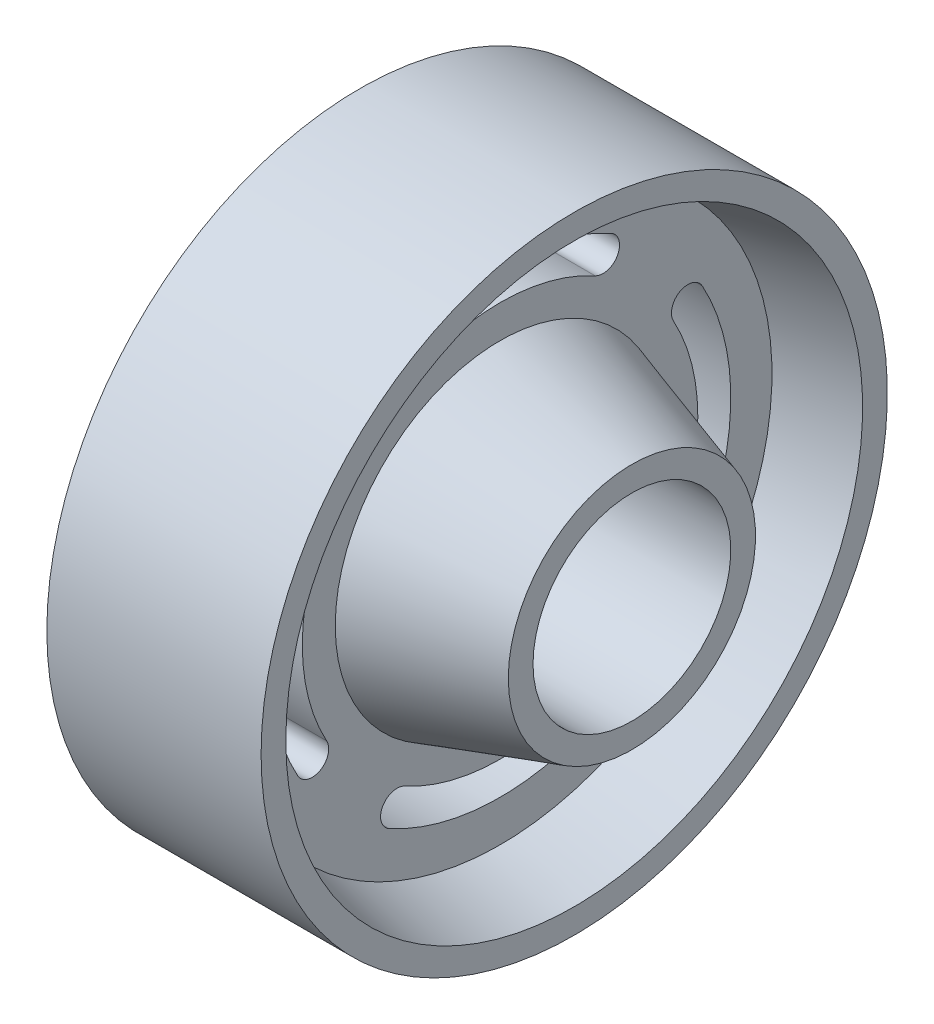
ISO-10303-21;
HEADER;
FILE_DESCRIPTION(('STEP AP214'),'2;1');
FILE_NAME('part.step','',(''),(''),'','','');
FILE_SCHEMA(('AUTOMOTIVE_DESIGN { 1 0 10303 214 1 1 1 1 }'));
ENDSEC;
DATA;
#1=APPLICATION_CONTEXT('core data for automotive mechanical design processes');
#2=APPLICATION_PROTOCOL_DEFINITION('international standard','automotive_design',2000,#1);
#3=PRODUCT_CONTEXT('',#1,'mechanical');
#4=PRODUCT('Part','Part','',(#3));
#5=PRODUCT_RELATED_PRODUCT_CATEGORY('part','',(#4));
#6=PRODUCT_DEFINITION_FORMATION('','',#4);
#7=PRODUCT_DEFINITION_CONTEXT('part definition',#1,'design');
#8=PRODUCT_DEFINITION('design','',#6,#7);
#9=PRODUCT_DEFINITION_SHAPE('','',#8);
#10=(LENGTH_UNIT() NAMED_UNIT(*) SI_UNIT(.MILLI.,.METRE.));
#11=(NAMED_UNIT(*) PLANE_ANGLE_UNIT() SI_UNIT($,.RADIAN.));
#12=(NAMED_UNIT(*) SI_UNIT($,.STERADIAN.) SOLID_ANGLE_UNIT());
#13=UNCERTAINTY_MEASURE_WITH_UNIT(LENGTH_MEASURE(1.E-05),#10,'distance_accuracy_value','');
#14=(GEOMETRIC_REPRESENTATION_CONTEXT(3) GLOBAL_UNCERTAINTY_ASSIGNED_CONTEXT((#13)) GLOBAL_UNIT_ASSIGNED_CONTEXT((#10,
#11,#12)) REPRESENTATION_CONTEXT('',''));
#15=CARTESIAN_POINT('',(0.,0.,0.));
#16=DIRECTION('',(0.,0.,1.));
#17=DIRECTION('',(1.,0.,0.));
#18=AXIS2_PLACEMENT_3D('',#15,#16,#17);
#19=CARTESIAN_POINT('',(-13.,38.,0.));
#20=DIRECTION('',(1.,0.,0.));
#21=DIRECTION('',(0.,0.,-1.));
#22=AXIS2_PLACEMENT_3D('',#19,#20,#21);
#23=PLANE('',#22);
#24=CARTESIAN_POINT('',(-13.,0.,0.));
#25=DIRECTION('',(-1.,0.,0.));
#26=DIRECTION('',(0.,0.,1.));
#27=AXIS2_PLACEMENT_3D('',#24,#25,#26);
#28=CIRCLE('',#27,35.);
#29=CARTESIAN_POINT('',(-13.,0.,35.));
#30=VERTEX_POINT('',#29);
#31=EDGE_CURVE('E356',#30,#30,#28,.T.);
#32=ORIENTED_EDGE('',*,*,#31,.F.);
#33=EDGE_LOOP('',(#32));
#34=FACE_BOUND('',#33,.T.);
#35=CARTESIAN_POINT('',(-13.,0.,0.));
#36=DIRECTION('',(-1.,0.,0.));
#37=DIRECTION('',(0.,0.,1.));
#38=AXIS2_PLACEMENT_3D('',#35,#36,#37);
#39=CIRCLE('',#38,38.);
#40=CARTESIAN_POINT('',(-13.,0.,38.));
#41=VERTEX_POINT('',#40);
#42=EDGE_CURVE('E312',#41,#41,#39,.T.);
#43=ORIENTED_EDGE('',*,*,#42,.T.);
#44=EDGE_LOOP('',(#43));
#45=FACE_BOUND('',#44,.T.);
#46=ADVANCED_FACE('F44',(#34,#45),#23,.F.);
#47=CARTESIAN_POINT('',(-13.,0.,0.));
#48=DIRECTION('',(-1.,0.,0.));
#49=DIRECTION('',(0.,0.,1.));
#50=AXIS2_PLACEMENT_3D('',#47,#48,#49);
#51=CONICAL_SURFACE('',#50,35.,0.218668945873942);
#52=CARTESIAN_POINT('',(-4.,0.,0.));
#53=DIRECTION('',(-1.,0.,0.));
#54=DIRECTION('',(0.,0.,1.));
#55=AXIS2_PLACEMENT_3D('',#52,#53,#54);
#56=CIRCLE('',#55,33.);
#57=CARTESIAN_POINT('',(-4.,0.,33.));
#58=VERTEX_POINT('',#57);
#59=EDGE_CURVE('E352',#58,#58,#56,.T.);
#60=ORIENTED_EDGE('',*,*,#59,.F.);
#61=EDGE_LOOP('',(#60));
#62=FACE_BOUND('',#61,.T.);
#63=ORIENTED_EDGE('',*,*,#31,.T.);
#64=EDGE_LOOP('',(#63));
#65=FACE_BOUND('',#64,.T.);
#66=ADVANCED_FACE('F400',(#62,#65),#51,.F.);
#67=CARTESIAN_POINT('',(-4.,33.,0.));
#68=DIRECTION('',(1.,0.,0.));
#69=DIRECTION('',(0.,0.,-1.));
#70=AXIS2_PLACEMENT_3D('',#67,#68,#69);
#71=PLANE('',#70);
#72=CARTESIAN_POINT('',(-4.,0.,0.));
#73=DIRECTION('',(1.,0.,0.));
#74=DIRECTION('',(0.,-1.,0.));
#75=AXIS2_PLACEMENT_3D('',#72,#73,#74);
#76=CIRCLE('',#75,28.);
#77=CARTESIAN_POINT('',(-4.,-13.4615384615385,-24.551720555768));
#78=VERTEX_POINT('',#77);
#79=CARTESIAN_POINT('',(-4.,13.4615384615384,-24.551720555768));
#80=VERTEX_POINT('',#79);
#81=EDGE_CURVE('E169',#78,#80,#76,.T.);
#82=ORIENTED_EDGE('',*,*,#81,.T.);
#83=CARTESIAN_POINT('',(-4.,12.4999999999999,-22.798026230356));
#84=DIRECTION('',(1.,0.,0.));
#85=DIRECTION('',(0.,-1.,0.));
#86=AXIS2_PLACEMENT_3D('',#83,#84,#85);
#87=CIRCLE('',#86,2.);
#88=CARTESIAN_POINT('',(-4.,11.5384615384615,-21.044331904944));
#89=VERTEX_POINT('',#88);
#90=EDGE_CURVE('E59',#80,#89,#87,.T.);
#91=ORIENTED_EDGE('',*,*,#90,.T.);
#92=CARTESIAN_POINT('',(-4.,0.,0.));
#93=DIRECTION('',(1.,0.,0.));
#94=DIRECTION('',(0.,-1.,0.));
#95=AXIS2_PLACEMENT_3D('',#92,#93,#94);
#96=CIRCLE('',#95,24.);
#97=CARTESIAN_POINT('',(-4.,-11.5384615384616,-21.044331904944));
#98=VERTEX_POINT('',#97);
#99=EDGE_CURVE('E183',#89,#98,#96,.F.);
#100=ORIENTED_EDGE('',*,*,#99,.T.);
#101=CARTESIAN_POINT('',(-4.,-12.5000000000001,-22.7980262303559));
#102=DIRECTION('',(1.,0.,0.));
#103=DIRECTION('',(0.,-1.,0.));
#104=AXIS2_PLACEMENT_3D('',#101,#102,#103);
#105=CIRCLE('',#104,2.);
#106=EDGE_CURVE('E732',#98,#78,#105,.T.);
#107=ORIENTED_EDGE('',*,*,#106,.T.);
#108=EDGE_LOOP('',(#82,#91,#100,#107));
#109=FACE_BOUND('',#108,.T.);
#110=CARTESIAN_POINT('',(-4.,0.,0.));
#111=DIRECTION('',(1.,0.,0.));
#112=DIRECTION('',(0.,0.,1.));
#113=AXIS2_PLACEMENT_3D('',#110,#111,#112);
#114=CIRCLE('',#113,28.);
#115=CARTESIAN_POINT('',(-4.,-24.551720555768,13.4615384615385));
#116=VERTEX_POINT('',#115);
#117=CARTESIAN_POINT('',(-4.,-24.551720555768,-13.4615384615385));
#118=VERTEX_POINT('',#117);
#119=EDGE_CURVE('E197',#116,#118,#114,.T.);
#120=ORIENTED_EDGE('',*,*,#119,.T.);
#121=CARTESIAN_POINT('',(-4.,-22.798026230356,-12.5));
#122=DIRECTION('',(1.,0.,0.));
#123=DIRECTION('',(0.,0.,1.));
#124=AXIS2_PLACEMENT_3D('',#121,#122,#123);
#125=CIRCLE('',#124,2.);
#126=CARTESIAN_POINT('',(-4.,-21.044331904944,-11.5384615384615));
#127=VERTEX_POINT('',#126);
#128=EDGE_CURVE('E67',#118,#127,#125,.T.);
#129=ORIENTED_EDGE('',*,*,#128,.T.);
#130=CARTESIAN_POINT('',(-4.,0.,0.));
#131=DIRECTION('',(1.,0.,0.));
#132=DIRECTION('',(0.,0.,1.));
#133=AXIS2_PLACEMENT_3D('',#130,#131,#132);
#134=CIRCLE('',#133,24.);
#135=CARTESIAN_POINT('',(-4.,-21.044331904944,11.5384615384615));
#136=VERTEX_POINT('',#135);
#137=EDGE_CURVE('E227',#127,#136,#134,.F.);
#138=ORIENTED_EDGE('',*,*,#137,.T.);
#139=CARTESIAN_POINT('',(-4.,-22.798026230356,12.5));
#140=DIRECTION('',(1.,0.,0.));
#141=DIRECTION('',(0.,0.,1.));
#142=AXIS2_PLACEMENT_3D('',#139,#140,#141);
#143=CIRCLE('',#142,2.);
#144=EDGE_CURVE('E216',#136,#116,#143,.T.);
#145=ORIENTED_EDGE('',*,*,#144,.T.);
#146=EDGE_LOOP('',(#120,#129,#138,#145));
#147=FACE_BOUND('',#146,.T.);
#148=CARTESIAN_POINT('',(-4.,0.,0.));
#149=DIRECTION('',(1.,0.,0.));
#150=DIRECTION('',(0.,1.,0.));
#151=AXIS2_PLACEMENT_3D('',#148,#149,#150);
#152=CIRCLE('',#151,28.);
#153=CARTESIAN_POINT('',(-4.,13.4615384615387,24.5517205557679));
#154=VERTEX_POINT('',#153);
#155=CARTESIAN_POINT('',(-4.,-13.4615384615382,24.5517205557681));
#156=VERTEX_POINT('',#155);
#157=EDGE_CURVE('E241',#154,#156,#152,.T.);
#158=ORIENTED_EDGE('',*,*,#157,.T.);
#159=CARTESIAN_POINT('',(-4.,-12.4999999999998,22.7980262303561));
#160=DIRECTION('',(1.,0.,0.));
#161=DIRECTION('',(0.,1.,0.));
#162=AXIS2_PLACEMENT_3D('',#159,#160,#161);
#163=CIRCLE('',#162,2.);
#164=CARTESIAN_POINT('',(-4.,-11.5384615384613,21.0443319049441));
#165=VERTEX_POINT('',#164);
#166=EDGE_CURVE('E198',#156,#165,#163,.T.);
#167=ORIENTED_EDGE('',*,*,#166,.T.);
#168=CARTESIAN_POINT('',(-4.,0.,0.));
#169=DIRECTION('',(1.,0.,0.));
#170=DIRECTION('',(0.,1.,0.));
#171=AXIS2_PLACEMENT_3D('',#168,#169,#170);
#172=CIRCLE('',#171,24.);
#173=CARTESIAN_POINT('',(-4.,11.5384615384618,21.0443319049439));
#174=VERTEX_POINT('',#173);
#175=EDGE_CURVE('E271',#165,#174,#172,.F.);
#176=ORIENTED_EDGE('',*,*,#175,.T.);
#177=CARTESIAN_POINT('',(-4.,12.5000000000002,22.7980262303559));
#178=DIRECTION('',(1.,0.,0.));
#179=DIRECTION('',(0.,1.,0.));
#180=AXIS2_PLACEMENT_3D('',#177,#178,#179);
#181=CIRCLE('',#180,2.);
#182=EDGE_CURVE('E260',#174,#154,#181,.T.);
#183=ORIENTED_EDGE('',*,*,#182,.T.);
#184=EDGE_LOOP('',(#158,#167,#176,#183));
#185=FACE_BOUND('',#184,.T.);
#186=CARTESIAN_POINT('',(-4.,0.,0.));
#187=DIRECTION('',(1.,0.,0.));
#188=DIRECTION('',(0.,0.,-1.));
#189=AXIS2_PLACEMENT_3D('',#186,#187,#188);
#190=CIRCLE('',#189,28.);
#191=CARTESIAN_POINT('',(-4.,24.551720555768,-13.4615384615385));
#192=VERTEX_POINT('',#191);
#193=CARTESIAN_POINT('',(-4.,24.551720555768,13.4615384615385));
#194=VERTEX_POINT('',#193);
#195=EDGE_CURVE('E286',#192,#194,#190,.T.);
#196=ORIENTED_EDGE('',*,*,#195,.T.);
#197=CARTESIAN_POINT('',(-4.,22.798026230356,12.5));
#198=DIRECTION('',(1.,0.,0.));
#199=DIRECTION('',(0.,0.,-1.));
#200=AXIS2_PLACEMENT_3D('',#197,#198,#199);
#201=CIRCLE('',#200,2.);
#202=CARTESIAN_POINT('',(-4.,21.044331904944,11.5384615384615));
#203=VERTEX_POINT('',#202);
#204=EDGE_CURVE('E308',#194,#203,#201,.T.);
#205=ORIENTED_EDGE('',*,*,#204,.T.);
#206=CARTESIAN_POINT('',(-4.,0.,0.));
#207=DIRECTION('',(1.,0.,0.));
#208=DIRECTION('',(0.,0.,-1.));
#209=AXIS2_PLACEMENT_3D('',#206,#207,#208);
#210=CIRCLE('',#209,24.);
#211=CARTESIAN_POINT('',(-4.,21.044331904944,-11.5384615384615));
#212=VERTEX_POINT('',#211);
#213=EDGE_CURVE('E304',#203,#212,#210,.F.);
#214=ORIENTED_EDGE('',*,*,#213,.T.);
#215=CARTESIAN_POINT('',(-4.,22.798026230356,-12.5));
#216=DIRECTION('',(1.,0.,0.));
#217=DIRECTION('',(0.,0.,-1.));
#218=AXIS2_PLACEMENT_3D('',#215,#216,#217);
#219=CIRCLE('',#218,2.);
#220=EDGE_CURVE('E300',#212,#192,#219,.T.);
#221=ORIENTED_EDGE('',*,*,#220,.T.);
#222=EDGE_LOOP('',(#196,#205,#214,#221));
#223=FACE_BOUND('',#222,.T.);
#224=CARTESIAN_POINT('',(-4.,0.,0.));
#225=DIRECTION('',(-1.,0.,0.));
#226=DIRECTION('',(0.,0.,1.));
#227=AXIS2_PLACEMENT_3D('',#224,#225,#226);
#228=CIRCLE('',#227,20.);
#229=CARTESIAN_POINT('',(-4.,0.,20.));
#230=VERTEX_POINT('',#229);
#231=EDGE_CURVE('E348',#230,#230,#228,.T.);
#232=ORIENTED_EDGE('',*,*,#231,.F.);
#233=EDGE_LOOP('',(#232));
#234=FACE_BOUND('',#233,.T.);
#235=ORIENTED_EDGE('',*,*,#59,.T.);
#236=EDGE_LOOP('',(#235));
#237=FACE_BOUND('',#236,.T.);
#238=ADVANCED_FACE('F379',(#109,#147,#185,#223,#234,#237),#71,.F.);
#239=CARTESIAN_POINT('',(-4.,0.,0.));
#240=DIRECTION('',(1.,0.,0.));
#241=DIRECTION('',(0.,0.,-1.));
#242=AXIS2_PLACEMENT_3D('',#239,#240,#241);
#243=CONICAL_SURFACE('',#242,20.,0.302884868374971);
#244=CARTESIAN_POINT('',(-20.,0.,0.));
#245=DIRECTION('',(-1.,0.,0.));
#246=DIRECTION('',(0.,0.,1.));
#247=AXIS2_PLACEMENT_3D('',#244,#245,#246);
#248=CIRCLE('',#247,15.);
#249=CARTESIAN_POINT('',(-20.,0.,15.));
#250=VERTEX_POINT('',#249);
#251=EDGE_CURVE('E344',#250,#250,#248,.T.);
#252=ORIENTED_EDGE('',*,*,#251,.F.);
#253=EDGE_LOOP('',(#252));
#254=FACE_BOUND('',#253,.T.);
#255=ORIENTED_EDGE('',*,*,#231,.T.);
#256=EDGE_LOOP('',(#255));
#257=FACE_BOUND('',#256,.T.);
#258=ADVANCED_FACE('F453',(#254,#257),#243,.T.);
#259=CARTESIAN_POINT('',(-20.,15.,0.));
#260=DIRECTION('',(1.,0.,0.));
#261=DIRECTION('',(0.,0.,-1.));
#262=AXIS2_PLACEMENT_3D('',#259,#260,#261);
#263=PLANE('',#262);
#264=CARTESIAN_POINT('',(-20.,0.,0.));
#265=DIRECTION('',(-1.,0.,0.));
#266=DIRECTION('',(0.,0.,1.));
#267=AXIS2_PLACEMENT_3D('',#264,#265,#266);
#268=CIRCLE('',#267,12.);
#269=CARTESIAN_POINT('',(-20.,0.,12.));
#270=VERTEX_POINT('',#269);
#271=EDGE_CURVE('E340',#270,#270,#268,.T.);
#272=ORIENTED_EDGE('',*,*,#271,.F.);
#273=EDGE_LOOP('',(#272));
#274=FACE_BOUND('',#273,.T.);
#275=ORIENTED_EDGE('',*,*,#251,.T.);
#276=EDGE_LOOP('',(#275));
#277=FACE_BOUND('',#276,.T.);
#278=ADVANCED_FACE('F447',(#274,#277),#263,.F.);
#279=CARTESIAN_POINT('',(0.,0.,0.));
#280=DIRECTION('',(-1.,0.,0.));
#281=DIRECTION('',(0.,0.,1.));
#282=AXIS2_PLACEMENT_3D('',#279,#280,#281);
#283=CYLINDRICAL_SURFACE('',#282,12.);
#284=CARTESIAN_POINT('',(20.,0.,0.));
#285=DIRECTION('',(-1.,0.,0.));
#286=DIRECTION('',(0.,0.,1.));
#287=AXIS2_PLACEMENT_3D('',#284,#285,#286);
#288=CIRCLE('',#287,12.);
#289=CARTESIAN_POINT('',(20.,0.,12.));
#290=VERTEX_POINT('',#289);
#291=EDGE_CURVE('E336',#290,#290,#288,.T.);
#292=ORIENTED_EDGE('',*,*,#291,.F.);
#293=EDGE_LOOP('',(#292));
#294=FACE_BOUND('',#293,.T.);
#295=ORIENTED_EDGE('',*,*,#271,.T.);
#296=EDGE_LOOP('',(#295));
#297=FACE_BOUND('',#296,.T.);
#298=ADVANCED_FACE('F441',(#294,#297),#283,.F.);
#299=CARTESIAN_POINT('',(20.,15.,0.));
#300=DIRECTION('',(-1.,0.,0.));
#301=DIRECTION('',(0.,0.,1.));
#302=AXIS2_PLACEMENT_3D('',#299,#300,#301);
#303=PLANE('',#302);
#304=CARTESIAN_POINT('',(20.,0.,0.));
#305=DIRECTION('',(-1.,0.,0.));
#306=DIRECTION('',(0.,0.,1.));
#307=AXIS2_PLACEMENT_3D('',#304,#305,#306);
#308=CIRCLE('',#307,15.);
#309=CARTESIAN_POINT('',(20.,0.,15.));
#310=VERTEX_POINT('',#309);
#311=EDGE_CURVE('E332',#310,#310,#308,.T.);
#312=ORIENTED_EDGE('',*,*,#311,.F.);
#313=EDGE_LOOP('',(#312));
#314=FACE_BOUND('',#313,.T.);
#315=ORIENTED_EDGE('',*,*,#291,.T.);
#316=EDGE_LOOP('',(#315));
#317=FACE_BOUND('',#316,.T.);
#318=ADVANCED_FACE('F435',(#314,#317),#303,.F.);
#319=CARTESIAN_POINT('',(20.,0.,0.));
#320=DIRECTION('',(-1.,0.,0.));
#321=DIRECTION('',(0.,0.,1.));
#322=AXIS2_PLACEMENT_3D('',#319,#320,#321);
#323=CONICAL_SURFACE('',#322,15.,0.302884868374971);
#324=CARTESIAN_POINT('',(4.,0.,0.));
#325=DIRECTION('',(-1.,0.,0.));
#326=DIRECTION('',(0.,0.,1.));
#327=AXIS2_PLACEMENT_3D('',#324,#325,#326);
#328=CIRCLE('',#327,20.);
#329=CARTESIAN_POINT('',(4.,0.,20.));
#330=VERTEX_POINT('',#329);
#331=EDGE_CURVE('E328',#330,#330,#328,.T.);
#332=ORIENTED_EDGE('',*,*,#331,.F.);
#333=EDGE_LOOP('',(#332));
#334=FACE_BOUND('',#333,.T.);
#335=ORIENTED_EDGE('',*,*,#311,.T.);
#336=EDGE_LOOP('',(#335));
#337=FACE_BOUND('',#336,.T.);
#338=ADVANCED_FACE('F429',(#334,#337),#323,.T.);
#339=CARTESIAN_POINT('',(4.,33.,0.));
#340=DIRECTION('',(-1.,0.,0.));
#341=DIRECTION('',(0.,0.,1.));
#342=AXIS2_PLACEMENT_3D('',#339,#340,#341);
#343=PLANE('',#342);
#344=CARTESIAN_POINT('',(4.,0.,0.));
#345=DIRECTION('',(-1.,0.,0.));
#346=DIRECTION('',(0.,1.,0.));
#347=AXIS2_PLACEMENT_3D('',#344,#345,#346);
#348=CIRCLE('',#347,24.);
#349=CARTESIAN_POINT('',(4.,-11.5384615384616,-21.044331904944));
#350=VERTEX_POINT('',#349);
#351=CARTESIAN_POINT('',(4.,11.5384615384615,-21.044331904944));
#352=VERTEX_POINT('',#351);
#353=EDGE_CURVE('E181',#350,#352,#348,.F.);
#354=ORIENTED_EDGE('',*,*,#353,.T.);
#355=CARTESIAN_POINT('',(4.,12.4999999999999,-22.798026230356));
#356=DIRECTION('',(-1.,0.,0.));
#357=DIRECTION('',(0.,1.,0.));
#358=AXIS2_PLACEMENT_3D('',#355,#356,#357);
#359=CIRCLE('',#358,2.);
#360=CARTESIAN_POINT('',(4.,13.4615384615384,-24.551720555768));
#361=VERTEX_POINT('',#360);
#362=EDGE_CURVE('E173',#352,#361,#359,.T.);
#363=ORIENTED_EDGE('',*,*,#362,.T.);
#364=CARTESIAN_POINT('',(4.,0.,0.));
#365=DIRECTION('',(-1.,0.,0.));
#366=DIRECTION('',(0.,1.,0.));
#367=AXIS2_PLACEMENT_3D('',#364,#365,#366);
#368=CIRCLE('',#367,28.);
#369=CARTESIAN_POINT('',(4.,-13.4615384615385,-24.551720555768));
#370=VERTEX_POINT('',#369);
#371=EDGE_CURVE('E159',#361,#370,#368,.T.);
#372=ORIENTED_EDGE('',*,*,#371,.T.);
#373=CARTESIAN_POINT('',(4.,-12.5000000000001,-22.7980262303559));
#374=DIRECTION('',(-1.,0.,0.));
#375=DIRECTION('',(0.,1.,0.));
#376=AXIS2_PLACEMENT_3D('',#373,#374,#375);
#377=CIRCLE('',#376,2.);
#378=EDGE_CURVE('E730',#370,#350,#377,.T.);
#379=ORIENTED_EDGE('',*,*,#378,.T.);
#380=EDGE_LOOP('',(#354,#363,#372,#379));
#381=FACE_BOUND('',#380,.T.);
#382=CARTESIAN_POINT('',(4.,0.,0.));
#383=DIRECTION('',(-1.,0.,0.));
#384=DIRECTION('',(0.,0.,-1.));
#385=AXIS2_PLACEMENT_3D('',#382,#383,#384);
#386=CIRCLE('',#385,24.);
#387=CARTESIAN_POINT('',(4.,-21.044331904944,11.5384615384615));
#388=VERTEX_POINT('',#387);
#389=CARTESIAN_POINT('',(4.,-21.044331904944,-11.5384615384615));
#390=VERTEX_POINT('',#389);
#391=EDGE_CURVE('E223',#388,#390,#386,.F.);
#392=ORIENTED_EDGE('',*,*,#391,.T.);
#393=CARTESIAN_POINT('',(4.,-22.798026230356,-12.5));
#394=DIRECTION('',(-1.,0.,0.));
#395=DIRECTION('',(0.,0.,-1.));
#396=AXIS2_PLACEMENT_3D('',#393,#394,#395);
#397=CIRCLE('',#396,2.);
#398=CARTESIAN_POINT('',(4.,-24.551720555768,-13.4615384615385));
#399=VERTEX_POINT('',#398);
#400=EDGE_CURVE('E231',#390,#399,#397,.T.);
#401=ORIENTED_EDGE('',*,*,#400,.T.);
#402=CARTESIAN_POINT('',(4.,0.,0.));
#403=DIRECTION('',(-1.,0.,0.));
#404=DIRECTION('',(0.,0.,-1.));
#405=AXIS2_PLACEMENT_3D('',#402,#403,#404);
#406=CIRCLE('',#405,28.);
#407=CARTESIAN_POINT('',(4.,-24.551720555768,13.4615384615385));
#408=VERTEX_POINT('',#407);
#409=EDGE_CURVE('E193',#399,#408,#406,.T.);
#410=ORIENTED_EDGE('',*,*,#409,.T.);
#411=CARTESIAN_POINT('',(4.,-22.798026230356,12.5));
#412=DIRECTION('',(-1.,0.,0.));
#413=DIRECTION('',(0.,0.,-1.));
#414=AXIS2_PLACEMENT_3D('',#411,#412,#413);
#415=CIRCLE('',#414,2.);
#416=EDGE_CURVE('E212',#408,#388,#415,.T.);
#417=ORIENTED_EDGE('',*,*,#416,.T.);
#418=EDGE_LOOP('',(#392,#401,#410,#417));
#419=FACE_BOUND('',#418,.T.);
#420=CARTESIAN_POINT('',(4.,0.,0.));
#421=DIRECTION('',(-1.,0.,0.));
#422=DIRECTION('',(0.,-1.,0.));
#423=AXIS2_PLACEMENT_3D('',#420,#421,#422);
#424=CIRCLE('',#423,24.);
#425=CARTESIAN_POINT('',(4.,11.5384615384618,21.0443319049439));
#426=VERTEX_POINT('',#425);
#427=CARTESIAN_POINT('',(4.,-11.5384615384613,21.0443319049441));
#428=VERTEX_POINT('',#427);
#429=EDGE_CURVE('E267',#426,#428,#424,.F.);
#430=ORIENTED_EDGE('',*,*,#429,.T.);
#431=CARTESIAN_POINT('',(4.,-12.4999999999998,22.7980262303561));
#432=DIRECTION('',(-1.,0.,0.));
#433=DIRECTION('',(0.,-1.,0.));
#434=AXIS2_PLACEMENT_3D('',#431,#432,#433);
#435=CIRCLE('',#434,2.);
#436=CARTESIAN_POINT('',(4.,-13.4615384615382,24.5517205557681));
#437=VERTEX_POINT('',#436);
#438=EDGE_CURVE('E275',#428,#437,#435,.T.);
#439=ORIENTED_EDGE('',*,*,#438,.T.);
#440=CARTESIAN_POINT('',(4.,0.,0.));
#441=DIRECTION('',(-1.,0.,0.));
#442=DIRECTION('',(0.,-1.,0.));
#443=AXIS2_PLACEMENT_3D('',#440,#441,#442);
#444=CIRCLE('',#443,28.);
#445=CARTESIAN_POINT('',(4.,13.4615384615387,24.5517205557679));
#446=VERTEX_POINT('',#445);
#447=EDGE_CURVE('E237',#437,#446,#444,.T.);
#448=ORIENTED_EDGE('',*,*,#447,.T.);
#449=CARTESIAN_POINT('',(4.,12.5000000000002,22.7980262303559));
#450=DIRECTION('',(-1.,0.,0.));
#451=DIRECTION('',(0.,-1.,0.));
#452=AXIS2_PLACEMENT_3D('',#449,#450,#451);
#453=CIRCLE('',#452,2.);
#454=EDGE_CURVE('E256',#446,#426,#453,.T.);
#455=ORIENTED_EDGE('',*,*,#454,.T.);
#456=EDGE_LOOP('',(#430,#439,#448,#455));
#457=FACE_BOUND('',#456,.T.);
#458=CARTESIAN_POINT('',(4.,0.,0.));
#459=DIRECTION('',(-1.,0.,0.));
#460=DIRECTION('',(0.,0.,1.));
#461=AXIS2_PLACEMENT_3D('',#458,#459,#460);
#462=CIRCLE('',#461,24.);
#463=CARTESIAN_POINT('',(4.,21.044331904944,-11.5384615384615));
#464=VERTEX_POINT('',#463);
#465=CARTESIAN_POINT('',(4.,21.044331904944,11.5384615384615));
#466=VERTEX_POINT('',#465);
#467=EDGE_CURVE('E52',#464,#466,#462,.F.);
#468=ORIENTED_EDGE('',*,*,#467,.T.);
#469=CARTESIAN_POINT('',(4.,22.798026230356,12.5));
#470=DIRECTION('',(-1.,0.,0.));
#471=DIRECTION('',(0.,0.,1.));
#472=AXIS2_PLACEMENT_3D('',#469,#470,#471);
#473=CIRCLE('',#472,2.);
#474=CARTESIAN_POINT('',(4.,24.551720555768,13.4615384615385));
#475=VERTEX_POINT('',#474);
#476=EDGE_CURVE('E11',#466,#475,#473,.T.);
#477=ORIENTED_EDGE('',*,*,#476,.T.);
#478=CARTESIAN_POINT('',(4.,0.,0.));
#479=DIRECTION('',(-1.,0.,0.));
#480=DIRECTION('',(0.,0.,1.));
#481=AXIS2_PLACEMENT_3D('',#478,#479,#480);
#482=CIRCLE('',#481,28.);
#483=CARTESIAN_POINT('',(4.,24.551720555768,-13.4615384615385));
#484=VERTEX_POINT('',#483);
#485=EDGE_CURVE('E360',#475,#484,#482,.T.);
#486=ORIENTED_EDGE('',*,*,#485,.T.);
#487=CARTESIAN_POINT('',(4.,22.798026230356,-12.5));
#488=DIRECTION('',(-1.,0.,0.));
#489=DIRECTION('',(0.,0.,1.));
#490=AXIS2_PLACEMENT_3D('',#487,#488,#489);
#491=CIRCLE('',#490,2.);
#492=EDGE_CURVE('E364',#484,#464,#491,.T.);
#493=ORIENTED_EDGE('',*,*,#492,.T.);
#494=EDGE_LOOP('',(#468,#477,#486,#493));
#495=FACE_BOUND('',#494,.T.);
#496=CARTESIAN_POINT('',(4.,0.,0.));
#497=DIRECTION('',(-1.,0.,0.));
#498=DIRECTION('',(0.,0.,1.));
#499=AXIS2_PLACEMENT_3D('',#496,#497,#498);
#500=CIRCLE('',#499,33.);
#501=CARTESIAN_POINT('',(4.,0.,33.));
#502=VERTEX_POINT('',#501);
#503=EDGE_CURVE('E324',#502,#502,#500,.T.);
#504=ORIENTED_EDGE('',*,*,#503,.F.);
#505=EDGE_LOOP('',(#504));
#506=FACE_BOUND('',#505,.T.);
#507=ORIENTED_EDGE('',*,*,#331,.T.);
#508=EDGE_LOOP('',(#507));
#509=FACE_BOUND('',#508,.T.);
#510=ADVANCED_FACE('F178',(#381,#419,#457,#495,#506,#509),#343,.F.);
#511=CARTESIAN_POINT('',(4.,0.,0.));
#512=DIRECTION('',(1.,0.,0.));
#513=DIRECTION('',(0.,0.,-1.));
#514=AXIS2_PLACEMENT_3D('',#511,#512,#513);
#515=CONICAL_SURFACE('',#514,33.,0.218668945873942);
#516=CARTESIAN_POINT('',(13.,0.,0.));
#517=DIRECTION('',(-1.,0.,0.));
#518=DIRECTION('',(0.,0.,1.));
#519=AXIS2_PLACEMENT_3D('',#516,#517,#518);
#520=CIRCLE('',#519,35.);
#521=CARTESIAN_POINT('',(13.,0.,35.));
#522=VERTEX_POINT('',#521);
#523=EDGE_CURVE('E320',#522,#522,#520,.T.);
#524=ORIENTED_EDGE('',*,*,#523,.F.);
#525=EDGE_LOOP('',(#524));
#526=FACE_BOUND('',#525,.T.);
#527=ORIENTED_EDGE('',*,*,#503,.T.);
#528=EDGE_LOOP('',(#527));
#529=FACE_BOUND('',#528,.T.);
#530=ADVANCED_FACE('F419',(#526,#529),#515,.F.);
#531=CARTESIAN_POINT('',(13.,38.,0.));
#532=DIRECTION('',(-1.,0.,0.));
#533=DIRECTION('',(0.,0.,1.));
#534=AXIS2_PLACEMENT_3D('',#531,#532,#533);
#535=PLANE('',#534);
#536=CARTESIAN_POINT('',(13.,0.,0.));
#537=DIRECTION('',(-1.,0.,0.));
#538=DIRECTION('',(0.,0.,1.));
#539=AXIS2_PLACEMENT_3D('',#536,#537,#538);
#540=CIRCLE('',#539,38.);
#541=CARTESIAN_POINT('',(13.,0.,38.));
#542=VERTEX_POINT('',#541);
#543=EDGE_CURVE('E316',#542,#542,#540,.T.);
#544=ORIENTED_EDGE('',*,*,#543,.F.);
#545=EDGE_LOOP('',(#544));
#546=FACE_BOUND('',#545,.T.);
#547=ORIENTED_EDGE('',*,*,#523,.T.);
#548=EDGE_LOOP('',(#547));
#549=FACE_BOUND('',#548,.T.);
#550=ADVANCED_FACE('F413',(#546,#549),#535,.F.);
#551=CARTESIAN_POINT('',(0.,0.,0.));
#552=DIRECTION('',(-1.,0.,0.));
#553=DIRECTION('',(0.,0.,1.));
#554=AXIS2_PLACEMENT_3D('',#551,#552,#553);
#555=CYLINDRICAL_SURFACE('',#554,38.);
#556=ORIENTED_EDGE('',*,*,#42,.F.);
#557=EDGE_LOOP('',(#556));
#558=FACE_BOUND('',#557,.T.);
#559=ORIENTED_EDGE('',*,*,#543,.T.);
#560=EDGE_LOOP('',(#559));
#561=FACE_BOUND('',#560,.T.);
#562=ADVANCED_FACE('F410',(#558,#561),#555,.T.);
#563=CARTESIAN_POINT('',(20.,22.798026230356,12.5));
#564=DIRECTION('',(-1.,0.,0.));
#565=DIRECTION('',(0.,0.,1.));
#566=AXIS2_PLACEMENT_3D('',#563,#564,#565);
#567=CYLINDRICAL_SURFACE('',#566,2.);
#568=DIRECTION('',(-1.,0.,0.));
#569=VECTOR('',#568,1.);
#570=CARTESIAN_POINT('',(20.,24.551720555768,13.4615384615385));
#571=LINE('',#570,#569);
#572=EDGE_CURVE('E187',#475,#194,#571,.T.);
#573=ORIENTED_EDGE('',*,*,#572,.F.);
#574=ORIENTED_EDGE('',*,*,#476,.F.);
#575=DIRECTION('',(-1.,0.,0.));
#576=VECTOR('',#575,1.);
#577=CARTESIAN_POINT('',(20.,21.044331904944,11.5384615384615));
#578=LINE('',#577,#576);
#579=EDGE_CURVE('E282',#466,#203,#578,.T.);
#580=ORIENTED_EDGE('',*,*,#579,.T.);
#581=ORIENTED_EDGE('',*,*,#204,.F.);
#582=EDGE_LOOP('',(#573,#574,#580,#581));
#583=FACE_BOUND('',#582,.T.);
#584=ADVANCED_FACE('F384',(#583),#567,.F.);
#585=CARTESIAN_POINT('',(20.,0.,0.));
#586=DIRECTION('',(-1.,0.,0.));
#587=DIRECTION('',(0.,0.,1.));
#588=AXIS2_PLACEMENT_3D('',#585,#586,#587);
#589=CYLINDRICAL_SURFACE('',#588,24.);
#590=ORIENTED_EDGE('',*,*,#579,.F.);
#591=ORIENTED_EDGE('',*,*,#467,.F.);
#592=DIRECTION('',(-1.,0.,0.));
#593=VECTOR('',#592,1.);
#594=CARTESIAN_POINT('',(20.,21.044331904944,-11.5384615384615));
#595=LINE('',#594,#593);
#596=EDGE_CURVE('E287',#464,#212,#595,.T.);
#597=ORIENTED_EDGE('',*,*,#596,.T.);
#598=ORIENTED_EDGE('',*,*,#213,.F.);
#599=EDGE_LOOP('',(#590,#591,#597,#598));
#600=FACE_BOUND('',#599,.T.);
#601=ADVANCED_FACE('F375',(#600),#589,.T.);
#602=CARTESIAN_POINT('',(20.,22.798026230356,-12.5));
#603=DIRECTION('',(-1.,0.,0.));
#604=DIRECTION('',(0.,0.,1.));
#605=AXIS2_PLACEMENT_3D('',#602,#603,#604);
#606=CYLINDRICAL_SURFACE('',#605,2.);
#607=ORIENTED_EDGE('',*,*,#596,.F.);
#608=ORIENTED_EDGE('',*,*,#492,.F.);
#609=DIRECTION('',(-1.,0.,0.));
#610=VECTOR('',#609,1.);
#611=CARTESIAN_POINT('',(20.,24.551720555768,-13.4615384615385));
#612=LINE('',#611,#610);
#613=EDGE_CURVE('E291',#484,#192,#612,.T.);
#614=ORIENTED_EDGE('',*,*,#613,.T.);
#615=ORIENTED_EDGE('',*,*,#220,.F.);
#616=EDGE_LOOP('',(#607,#608,#614,#615));
#617=FACE_BOUND('',#616,.T.);
#618=ADVANCED_FACE('F377',(#617),#606,.F.);
#619=CARTESIAN_POINT('',(20.,0.,0.));
#620=DIRECTION('',(-1.,0.,0.));
#621=DIRECTION('',(0.,0.,1.));
#622=AXIS2_PLACEMENT_3D('',#619,#620,#621);
#623=CYLINDRICAL_SURFACE('',#622,28.);
#624=ORIENTED_EDGE('',*,*,#613,.F.);
#625=ORIENTED_EDGE('',*,*,#485,.F.);
#626=ORIENTED_EDGE('',*,*,#572,.T.);
#627=ORIENTED_EDGE('',*,*,#195,.F.);
#628=EDGE_LOOP('',(#624,#625,#626,#627));
#629=FACE_BOUND('',#628,.T.);
#630=ADVANCED_FACE('F386',(#629),#623,.F.);
#631=CARTESIAN_POINT('',(20.,-12.4999999999998,22.7980262303561));
#632=DIRECTION('',(-1.,0.,0.));
#633=DIRECTION('',(0.,-1.,0.));
#634=AXIS2_PLACEMENT_3D('',#631,#632,#633);
#635=CYLINDRICAL_SURFACE('',#634,2.);
#636=DIRECTION('',(-1.,0.,0.));
#637=VECTOR('',#636,1.);
#638=CARTESIAN_POINT('',(20.,-13.4615384615382,24.5517205557681));
#639=LINE('',#638,#637);
#640=EDGE_CURVE('E249',#437,#156,#639,.T.);
#641=ORIENTED_EDGE('',*,*,#640,.F.);
#642=ORIENTED_EDGE('',*,*,#438,.F.);
#643=DIRECTION('',(-1.,0.,0.));
#644=VECTOR('',#643,1.);
#645=CARTESIAN_POINT('',(20.,-11.5384615384613,21.0443319049441));
#646=LINE('',#645,#644);
#647=EDGE_CURVE('E264',#428,#165,#646,.T.);
#648=ORIENTED_EDGE('',*,*,#647,.T.);
#649=ORIENTED_EDGE('',*,*,#166,.F.);
#650=EDGE_LOOP('',(#641,#642,#648,#649));
#651=FACE_BOUND('',#650,.T.);
#652=ADVANCED_FACE('F388',(#651),#635,.F.);
#653=CARTESIAN_POINT('',(20.,0.,0.));
#654=DIRECTION('',(-1.,0.,0.));
#655=DIRECTION('',(0.,-1.,0.));
#656=AXIS2_PLACEMENT_3D('',#653,#654,#655);
#657=CYLINDRICAL_SURFACE('',#656,24.);
#658=ORIENTED_EDGE('',*,*,#647,.F.);
#659=ORIENTED_EDGE('',*,*,#429,.F.);
#660=DIRECTION('',(-1.,0.,0.));
#661=VECTOR('',#660,1.);
#662=CARTESIAN_POINT('',(20.,11.5384615384618,21.0443319049439));
#663=LINE('',#662,#661);
#664=EDGE_CURVE('E253',#426,#174,#663,.T.);
#665=ORIENTED_EDGE('',*,*,#664,.T.);
#666=ORIENTED_EDGE('',*,*,#175,.F.);
#667=EDGE_LOOP('',(#658,#659,#665,#666));
#668=FACE_BOUND('',#667,.T.);
#669=ADVANCED_FACE('F394',(#668),#657,.T.);
#670=CARTESIAN_POINT('',(20.,12.5000000000002,22.7980262303559));
#671=DIRECTION('',(-1.,0.,0.));
#672=DIRECTION('',(0.,-1.,0.));
#673=AXIS2_PLACEMENT_3D('',#670,#671,#672);
#674=CYLINDRICAL_SURFACE('',#673,2.);
#675=ORIENTED_EDGE('',*,*,#664,.F.);
#676=ORIENTED_EDGE('',*,*,#454,.F.);
#677=DIRECTION('',(-1.,0.,0.));
#678=VECTOR('',#677,1.);
#679=CARTESIAN_POINT('',(20.,13.4615384615387,24.5517205557679));
#680=LINE('',#679,#678);
#681=EDGE_CURVE('E245',#446,#154,#680,.T.);
#682=ORIENTED_EDGE('',*,*,#681,.T.);
#683=ORIENTED_EDGE('',*,*,#182,.F.);
#684=EDGE_LOOP('',(#675,#676,#682,#683));
#685=FACE_BOUND('',#684,.T.);
#686=ADVANCED_FACE('F480',(#685),#674,.F.);
#687=CARTESIAN_POINT('',(20.,0.,0.));
#688=DIRECTION('',(-1.,0.,0.));
#689=DIRECTION('',(0.,-1.,0.));
#690=AXIS2_PLACEMENT_3D('',#687,#688,#689);
#691=CYLINDRICAL_SURFACE('',#690,28.);
#692=ORIENTED_EDGE('',*,*,#681,.F.);
#693=ORIENTED_EDGE('',*,*,#447,.F.);
#694=ORIENTED_EDGE('',*,*,#640,.T.);
#695=ORIENTED_EDGE('',*,*,#157,.F.);
#696=EDGE_LOOP('',(#692,#693,#694,#695));
#697=FACE_BOUND('',#696,.T.);
#698=ADVANCED_FACE('F484',(#697),#691,.F.);
#699=CARTESIAN_POINT('',(20.,-22.798026230356,-12.5));
#700=DIRECTION('',(-1.,0.,0.));
#701=DIRECTION('',(0.,0.,-1.));
#702=AXIS2_PLACEMENT_3D('',#699,#700,#701);
#703=CYLINDRICAL_SURFACE('',#702,2.);
#704=DIRECTION('',(-1.,0.,0.));
#705=VECTOR('',#704,1.);
#706=CARTESIAN_POINT('',(20.,-24.551720555768,-13.4615384615385));
#707=LINE('',#706,#705);
#708=EDGE_CURVE('E206',#399,#118,#707,.T.);
#709=ORIENTED_EDGE('',*,*,#708,.F.);
#710=ORIENTED_EDGE('',*,*,#400,.F.);
#711=DIRECTION('',(-1.,0.,0.));
#712=VECTOR('',#711,1.);
#713=CARTESIAN_POINT('',(20.,-21.044331904944,-11.5384615384615));
#714=LINE('',#713,#712);
#715=EDGE_CURVE('E220',#390,#127,#714,.T.);
#716=ORIENTED_EDGE('',*,*,#715,.T.);
#717=ORIENTED_EDGE('',*,*,#128,.F.);
#718=EDGE_LOOP('',(#709,#710,#716,#717));
#719=FACE_BOUND('',#718,.T.);
#720=ADVANCED_FACE('F488',(#719),#703,.F.);
#721=CARTESIAN_POINT('',(20.,0.,0.));
#722=DIRECTION('',(-1.,0.,0.));
#723=DIRECTION('',(0.,0.,-1.));
#724=AXIS2_PLACEMENT_3D('',#721,#722,#723);
#725=CYLINDRICAL_SURFACE('',#724,24.);
#726=ORIENTED_EDGE('',*,*,#715,.F.);
#727=ORIENTED_EDGE('',*,*,#391,.F.);
#728=DIRECTION('',(-1.,0.,0.));
#729=VECTOR('',#728,1.);
#730=CARTESIAN_POINT('',(20.,-21.044331904944,11.5384615384615));
#731=LINE('',#730,#729);
#732=EDGE_CURVE('E209',#388,#136,#731,.T.);
#733=ORIENTED_EDGE('',*,*,#732,.T.);
#734=ORIENTED_EDGE('',*,*,#137,.F.);
#735=EDGE_LOOP('',(#726,#727,#733,#734));
#736=FACE_BOUND('',#735,.T.);
#737=ADVANCED_FACE('F492',(#736),#725,.T.);
#738=CARTESIAN_POINT('',(20.,-22.798026230356,12.5));
#739=DIRECTION('',(-1.,0.,0.));
#740=DIRECTION('',(0.,0.,-1.));
#741=AXIS2_PLACEMENT_3D('',#738,#739,#740);
#742=CYLINDRICAL_SURFACE('',#741,2.);
#743=ORIENTED_EDGE('',*,*,#732,.F.);
#744=ORIENTED_EDGE('',*,*,#416,.F.);
#745=DIRECTION('',(-1.,0.,0.));
#746=VECTOR('',#745,1.);
#747=CARTESIAN_POINT('',(20.,-24.551720555768,13.4615384615385));
#748=LINE('',#747,#746);
#749=EDGE_CURVE('E202',#408,#116,#748,.T.);
#750=ORIENTED_EDGE('',*,*,#749,.T.);
#751=ORIENTED_EDGE('',*,*,#144,.F.);
#752=EDGE_LOOP('',(#743,#744,#750,#751));
#753=FACE_BOUND('',#752,.T.);
#754=ADVANCED_FACE('F495',(#753),#742,.F.);
#755=CARTESIAN_POINT('',(20.,0.,0.));
#756=DIRECTION('',(-1.,0.,0.));
#757=DIRECTION('',(0.,0.,-1.));
#758=AXIS2_PLACEMENT_3D('',#755,#756,#757);
#759=CYLINDRICAL_SURFACE('',#758,28.);
#760=ORIENTED_EDGE('',*,*,#749,.F.);
#761=ORIENTED_EDGE('',*,*,#409,.F.);
#762=ORIENTED_EDGE('',*,*,#708,.T.);
#763=ORIENTED_EDGE('',*,*,#119,.F.);
#764=EDGE_LOOP('',(#760,#761,#762,#763));
#765=FACE_BOUND('',#764,.T.);
#766=ADVANCED_FACE('F499',(#765),#759,.F.);
#767=CARTESIAN_POINT('',(20.,12.4999999999999,-22.798026230356));
#768=DIRECTION('',(-1.,0.,0.));
#769=DIRECTION('',(0.,1.,0.));
#770=AXIS2_PLACEMENT_3D('',#767,#768,#769);
#771=CYLINDRICAL_SURFACE('',#770,2.);
#772=DIRECTION('',(-1.,0.,0.));
#773=VECTOR('',#772,1.);
#774=CARTESIAN_POINT('',(20.,13.4615384615384,-24.551720555768));
#775=LINE('',#774,#773);
#776=EDGE_CURVE('E161',#361,#80,#775,.T.);
#777=ORIENTED_EDGE('',*,*,#776,.F.);
#778=ORIENTED_EDGE('',*,*,#362,.F.);
#779=DIRECTION('',(-1.,0.,0.));
#780=VECTOR('',#779,1.);
#781=CARTESIAN_POINT('',(20.,11.5384615384615,-21.044331904944));
#782=LINE('',#781,#780);
#783=EDGE_CURVE('E736',#352,#89,#782,.T.);
#784=ORIENTED_EDGE('',*,*,#783,.T.);
#785=ORIENTED_EDGE('',*,*,#90,.F.);
#786=EDGE_LOOP('',(#777,#778,#784,#785));
#787=FACE_BOUND('',#786,.T.);
#788=ADVANCED_FACE('F172',(#787),#771,.F.);
#789=CARTESIAN_POINT('',(20.,0.,0.));
#790=DIRECTION('',(-1.,0.,0.));
#791=DIRECTION('',(0.,1.,0.));
#792=AXIS2_PLACEMENT_3D('',#789,#790,#791);
#793=CYLINDRICAL_SURFACE('',#792,24.);
#794=ORIENTED_EDGE('',*,*,#783,.F.);
#795=ORIENTED_EDGE('',*,*,#353,.F.);
#796=DIRECTION('',(-1.,0.,0.));
#797=VECTOR('',#796,1.);
#798=CARTESIAN_POINT('',(20.,-11.5384615384616,-21.044331904944));
#799=LINE('',#798,#797);
#800=EDGE_CURVE('E176',#350,#98,#799,.T.);
#801=ORIENTED_EDGE('',*,*,#800,.T.);
#802=ORIENTED_EDGE('',*,*,#99,.F.);
#803=EDGE_LOOP('',(#794,#795,#801,#802));
#804=FACE_BOUND('',#803,.T.);
#805=ADVANCED_FACE('F506',(#804),#793,.T.);
#806=CARTESIAN_POINT('',(20.,-12.5000000000001,-22.7980262303559));
#807=DIRECTION('',(-1.,0.,0.));
#808=DIRECTION('',(0.,1.,0.));
#809=AXIS2_PLACEMENT_3D('',#806,#807,#808);
#810=CYLINDRICAL_SURFACE('',#809,2.);
#811=ORIENTED_EDGE('',*,*,#800,.F.);
#812=ORIENTED_EDGE('',*,*,#378,.F.);
#813=DIRECTION('',(-1.,0.,0.));
#814=VECTOR('',#813,1.);
#815=CARTESIAN_POINT('',(20.,-13.4615384615385,-24.551720555768));
#816=LINE('',#815,#814);
#817=EDGE_CURVE('E164',#370,#78,#816,.T.);
#818=ORIENTED_EDGE('',*,*,#817,.T.);
#819=ORIENTED_EDGE('',*,*,#106,.F.);
#820=EDGE_LOOP('',(#811,#812,#818,#819));
#821=FACE_BOUND('',#820,.T.);
#822=ADVANCED_FACE('F509',(#821),#810,.F.);
#823=CARTESIAN_POINT('',(20.,0.,0.));
#824=DIRECTION('',(-1.,0.,0.));
#825=DIRECTION('',(0.,1.,0.));
#826=AXIS2_PLACEMENT_3D('',#823,#824,#825);
#827=CYLINDRICAL_SURFACE('',#826,28.);
#828=ORIENTED_EDGE('',*,*,#817,.F.);
#829=ORIENTED_EDGE('',*,*,#371,.F.);
#830=ORIENTED_EDGE('',*,*,#776,.T.);
#831=ORIENTED_EDGE('',*,*,#81,.F.);
#832=EDGE_LOOP('',(#828,#829,#830,#831));
#833=FACE_BOUND('',#832,.T.);
#834=ADVANCED_FACE('F160',(#833),#827,.F.);
#835=CLOSED_SHELL('',(#46,#66,#238,#258,#278,#298,#318,#338,#510,#530,#550,#562,#584,#601,#618,
#630,#652,#669,#686,#698,#720,#737,#754,#766,#788,#805,#822,#834));
#836=MANIFOLD_SOLID_BREP('B2',#835);
#837=ADVANCED_BREP_SHAPE_REPRESENTATION('',(#18,#836),#14);
#838=SHAPE_DEFINITION_REPRESENTATION(#9,#837);
ENDSEC;
END-ISO-10303-21;
